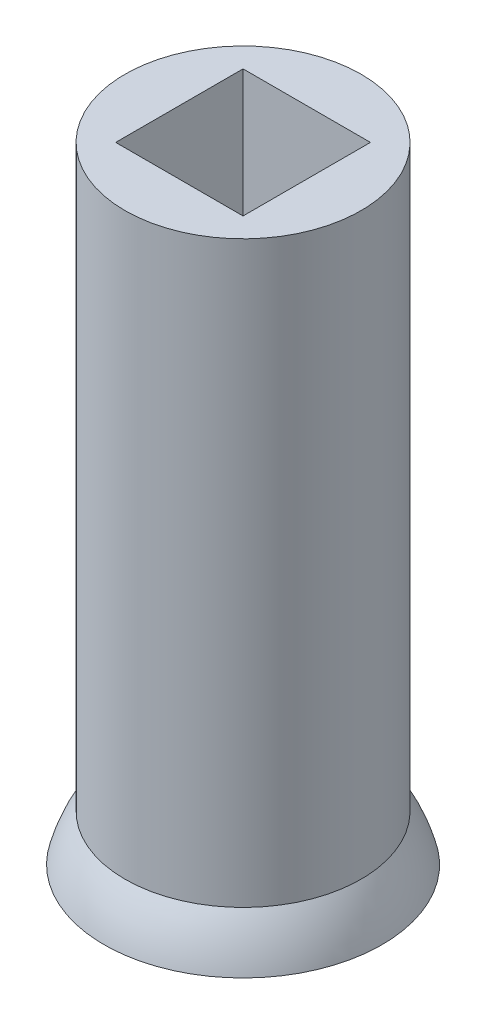
ISO-10303-21;
HEADER;
FILE_DESCRIPTION(('STEP AP214'),'2;1');
FILE_NAME('part.step','',(''),(''),'','','');
FILE_SCHEMA(('AUTOMOTIVE_DESIGN { 1 0 10303 214 1 1 1 1 }'));
ENDSEC;
DATA;
#1=APPLICATION_CONTEXT('core data for automotive mechanical design processes');
#2=APPLICATION_PROTOCOL_DEFINITION('international standard','automotive_design',2000,#1);
#3=PRODUCT_CONTEXT('',#1,'mechanical');
#4=PRODUCT('Part','Part','',(#3));
#5=PRODUCT_RELATED_PRODUCT_CATEGORY('part','',(#4));
#6=PRODUCT_DEFINITION_FORMATION('','',#4);
#7=PRODUCT_DEFINITION_CONTEXT('part definition',#1,'design');
#8=PRODUCT_DEFINITION('design','',#6,#7);
#9=PRODUCT_DEFINITION_SHAPE('','',#8);
#10=(LENGTH_UNIT() NAMED_UNIT(*) SI_UNIT(.MILLI.,.METRE.));
#11=(NAMED_UNIT(*) PLANE_ANGLE_UNIT() SI_UNIT($,.RADIAN.));
#12=(NAMED_UNIT(*) SI_UNIT($,.STERADIAN.) SOLID_ANGLE_UNIT());
#13=UNCERTAINTY_MEASURE_WITH_UNIT(LENGTH_MEASURE(1.E-05),#10,'distance_accuracy_value','');
#14=(GEOMETRIC_REPRESENTATION_CONTEXT(3) GLOBAL_UNCERTAINTY_ASSIGNED_CONTEXT((#13)) GLOBAL_UNIT_ASSIGNED_CONTEXT((#10,
#11,#12)) REPRESENTATION_CONTEXT('',''));
#15=CARTESIAN_POINT('',(0.,0.,0.));
#16=DIRECTION('',(0.,0.,1.));
#17=DIRECTION('',(1.,0.,0.));
#18=AXIS2_PLACEMENT_3D('',#15,#16,#17);
#19=CARTESIAN_POINT('',(0.,7.,0.));
#20=DIRECTION('',(0.,1.,0.));
#21=DIRECTION('',(0.,0.,1.));
#22=AXIS2_PLACEMENT_3D('',#19,#20,#21);
#23=PLANE('',#22);
#24=DIRECTION('',(-1.,0.,0.));
#25=VECTOR('',#24,1.);
#26=CARTESIAN_POINT('',(-1.49,7.,-1.99));
#27=LINE('',#26,#25);
#28=CARTESIAN_POINT('',(1.49,7.,-1.99));
#29=VERTEX_POINT('',#28);
#30=CARTESIAN_POINT('',(-1.49,7.,-1.99));
#31=VERTEX_POINT('',#30);
#32=EDGE_CURVE('E189',#29,#31,#27,.T.);
#33=ORIENTED_EDGE('',*,*,#32,.F.);
#34=DIRECTION('',(0.,0.,-1.));
#35=VECTOR('',#34,1.);
#36=CARTESIAN_POINT('',(1.49,7.,-1.99));
#37=LINE('',#36,#35);
#38=CARTESIAN_POINT('',(1.49,7.,1.99));
#39=VERTEX_POINT('',#38);
#40=EDGE_CURVE('E186',#39,#29,#37,.T.);
#41=ORIENTED_EDGE('',*,*,#40,.F.);
#42=DIRECTION('',(1.,0.,0.));
#43=VECTOR('',#42,1.);
#44=CARTESIAN_POINT('',(-1.49,7.,1.99));
#45=LINE('',#44,#43);
#46=CARTESIAN_POINT('',(-1.49,7.,1.99));
#47=VERTEX_POINT('',#46);
#48=EDGE_CURVE('E196',#47,#39,#45,.T.);
#49=ORIENTED_EDGE('',*,*,#48,.F.);
#50=DIRECTION('',(0.,0.,1.));
#51=VECTOR('',#50,1.);
#52=CARTESIAN_POINT('',(-1.49,7.,-1.99));
#53=LINE('',#52,#51);
#54=EDGE_CURVE('E193',#31,#47,#53,.T.);
#55=ORIENTED_EDGE('',*,*,#54,.F.);
#56=EDGE_LOOP('',(#33,#41,#49,#55));
#57=FACE_BOUND('',#56,.T.);
#58=DIRECTION('',(1.,0.,0.));
#59=VECTOR('',#58,1.);
#60=CARTESIAN_POINT('',(-5.5,7.,5.5));
#61=LINE('',#60,#59);
#62=CARTESIAN_POINT('',(-5.5,7.,5.5));
#63=VERTEX_POINT('',#62);
#64=CARTESIAN_POINT('',(5.5,7.,5.5));
#65=VERTEX_POINT('',#64);
#66=EDGE_CURVE('E124',#63,#65,#61,.T.);
#67=ORIENTED_EDGE('',*,*,#66,.T.);
#68=DIRECTION('',(0.,0.,-1.));
#69=VECTOR('',#68,1.);
#70=CARTESIAN_POINT('',(5.5,7.,-5.5));
#71=LINE('',#70,#69);
#72=CARTESIAN_POINT('',(5.5,7.,-5.5));
#73=VERTEX_POINT('',#72);
#74=EDGE_CURVE('E147',#65,#73,#71,.T.);
#75=ORIENTED_EDGE('',*,*,#74,.T.);
#76=DIRECTION('',(-1.,0.,0.));
#77=VECTOR('',#76,1.);
#78=CARTESIAN_POINT('',(-5.5,7.,-5.5));
#79=LINE('',#78,#77);
#80=CARTESIAN_POINT('',(-5.5,7.,-5.5));
#81=VERTEX_POINT('',#80);
#82=EDGE_CURVE('E130',#73,#81,#79,.T.);
#83=ORIENTED_EDGE('',*,*,#82,.T.);
#84=DIRECTION('',(0.,0.,1.));
#85=VECTOR('',#84,1.);
#86=CARTESIAN_POINT('',(-5.5,7.,-5.5));
#87=LINE('',#86,#85);
#88=EDGE_CURVE('E152',#81,#63,#87,.T.);
#89=ORIENTED_EDGE('',*,*,#88,.T.);
#90=EDGE_LOOP('',(#67,#75,#83,#89));
#91=FACE_BOUND('',#90,.T.);
#92=ADVANCED_FACE('F47',(#57,#91),#23,.T.);
#93=CARTESIAN_POINT('',(0.,7.,0.));
#94=DIRECTION('',(0.,-1.,0.));
#95=DIRECTION('',(0.,0.,-1.));
#96=AXIS2_PLACEMENT_3D('',#93,#94,#95);
#97=CYLINDRICAL_SURFACE('',#96,3.49);
#98=CARTESIAN_POINT('',(0.,0.,0.));
#99=DIRECTION('',(0.,1.,0.));
#100=DIRECTION('',(0.,0.,1.));
#101=AXIS2_PLACEMENT_3D('',#98,#99,#100);
#102=CIRCLE('',#101,3.49);
#103=CARTESIAN_POINT('',(0.,0.,3.49));
#104=VERTEX_POINT('',#103);
#105=EDGE_CURVE('E56',#104,#104,#102,.T.);
#106=ORIENTED_EDGE('',*,*,#105,.T.);
#107=EDGE_LOOP('',(#106));
#108=FACE_BOUND('',#107,.T.);
#109=CARTESIAN_POINT('',(0.,6.,0.));
#110=DIRECTION('',(0.,1.,0.));
#111=DIRECTION('',(0.,0.,1.));
#112=AXIS2_PLACEMENT_3D('',#109,#110,#111);
#113=CIRCLE('',#112,3.49);
#114=CARTESIAN_POINT('',(0.,6.,3.49));
#115=VERTEX_POINT('',#114);
#116=EDGE_CURVE('E11',#115,#115,#113,.T.);
#117=ORIENTED_EDGE('',*,*,#116,.F.);
#118=EDGE_LOOP('',(#117));
#119=FACE_BOUND('',#118,.T.);
#120=ADVANCED_FACE('F49',(#108,#119),#97,.T.);
#121=CARTESIAN_POINT('',(0.,0.,0.));
#122=DIRECTION('',(0.,1.,0.));
#123=DIRECTION('',(0.,0.,1.));
#124=AXIS2_PLACEMENT_3D('',#121,#122,#123);
#125=PLANE('',#124);
#126=ORIENTED_EDGE('',*,*,#105,.F.);
#127=EDGE_LOOP('',(#126));
#128=FACE_BOUND('',#127,.T.);
#129=DIRECTION('',(0.,0.,-1.));
#130=VECTOR('',#129,1.);
#131=CARTESIAN_POINT('',(1.49,0.,-1.99));
#132=LINE('',#131,#130);
#133=CARTESIAN_POINT('',(1.49,0.,1.99));
#134=VERTEX_POINT('',#133);
#135=CARTESIAN_POINT('',(1.49,0.,-1.99));
#136=VERTEX_POINT('',#135);
#137=EDGE_CURVE('E185',#134,#136,#132,.T.);
#138=ORIENTED_EDGE('',*,*,#137,.T.);
#139=DIRECTION('',(-1.,0.,0.));
#140=VECTOR('',#139,1.);
#141=CARTESIAN_POINT('',(-1.49,0.,-1.99));
#142=LINE('',#141,#140);
#143=CARTESIAN_POINT('',(-1.49,0.,-1.99));
#144=VERTEX_POINT('',#143);
#145=EDGE_CURVE('E203',#136,#144,#142,.T.);
#146=ORIENTED_EDGE('',*,*,#145,.T.);
#147=DIRECTION('',(0.,0.,1.));
#148=VECTOR('',#147,1.);
#149=CARTESIAN_POINT('',(-1.49,0.,-1.99));
#150=LINE('',#149,#148);
#151=CARTESIAN_POINT('',(-1.49,0.,1.99));
#152=VERTEX_POINT('',#151);
#153=EDGE_CURVE('E207',#144,#152,#150,.T.);
#154=ORIENTED_EDGE('',*,*,#153,.T.);
#155=DIRECTION('',(1.,0.,0.));
#156=VECTOR('',#155,1.);
#157=CARTESIAN_POINT('',(-1.49,0.,1.99));
#158=LINE('',#157,#156);
#159=EDGE_CURVE('E190',#152,#134,#158,.T.);
#160=ORIENTED_EDGE('',*,*,#159,.T.);
#161=EDGE_LOOP('',(#138,#146,#154,#160));
#162=FACE_BOUND('',#161,.T.);
#163=ADVANCED_FACE('F231',(#128,#162),#125,.F.);
#164=CARTESIAN_POINT('',(1.49,7.,-1.99));
#165=DIRECTION('',(-1.,0.,0.));
#166=DIRECTION('',(0.,0.,1.));
#167=AXIS2_PLACEMENT_3D('',#164,#165,#166);
#168=PLANE('',#167);
#169=ORIENTED_EDGE('',*,*,#137,.F.);
#170=DIRECTION('',(0.,-1.,0.));
#171=VECTOR('',#170,1.);
#172=CARTESIAN_POINT('',(1.49,7.,1.99));
#173=LINE('',#172,#171);
#174=EDGE_CURVE('E199',#39,#134,#173,.T.);
#175=ORIENTED_EDGE('',*,*,#174,.F.);
#176=ORIENTED_EDGE('',*,*,#40,.T.);
#177=DIRECTION('',(0.,-1.,0.));
#178=VECTOR('',#177,1.);
#179=CARTESIAN_POINT('',(1.49,7.,-1.99));
#180=LINE('',#179,#178);
#181=EDGE_CURVE('E222',#29,#136,#180,.T.);
#182=ORIENTED_EDGE('',*,*,#181,.T.);
#183=EDGE_LOOP('',(#169,#175,#176,#182));
#184=FACE_BOUND('',#183,.T.);
#185=ADVANCED_FACE('F234',(#184),#168,.T.);
#186=CARTESIAN_POINT('',(-1.49,7.,-1.99));
#187=DIRECTION('',(0.,0.,1.));
#188=DIRECTION('',(1.,0.,0.));
#189=AXIS2_PLACEMENT_3D('',#186,#187,#188);
#190=PLANE('',#189);
#191=ORIENTED_EDGE('',*,*,#145,.F.);
#192=ORIENTED_EDGE('',*,*,#181,.F.);
#193=ORIENTED_EDGE('',*,*,#32,.T.);
#194=DIRECTION('',(0.,-1.,0.));
#195=VECTOR('',#194,1.);
#196=CARTESIAN_POINT('',(-1.49,7.,-1.99));
#197=LINE('',#196,#195);
#198=EDGE_CURVE('E219',#31,#144,#197,.T.);
#199=ORIENTED_EDGE('',*,*,#198,.T.);
#200=EDGE_LOOP('',(#191,#192,#193,#199));
#201=FACE_BOUND('',#200,.T.);
#202=ADVANCED_FACE('F246',(#201),#190,.T.);
#203=CARTESIAN_POINT('',(-1.49,7.,-1.99));
#204=DIRECTION('',(1.,0.,0.));
#205=DIRECTION('',(0.,0.,-1.));
#206=AXIS2_PLACEMENT_3D('',#203,#204,#205);
#207=PLANE('',#206);
#208=ORIENTED_EDGE('',*,*,#153,.F.);
#209=ORIENTED_EDGE('',*,*,#198,.F.);
#210=ORIENTED_EDGE('',*,*,#54,.T.);
#211=DIRECTION('',(0.,-1.,0.));
#212=VECTOR('',#211,1.);
#213=CARTESIAN_POINT('',(-1.49,7.,1.99));
#214=LINE('',#213,#212);
#215=EDGE_CURVE('E71',#47,#152,#214,.T.);
#216=ORIENTED_EDGE('',*,*,#215,.T.);
#217=EDGE_LOOP('',(#208,#209,#210,#216));
#218=FACE_BOUND('',#217,.T.);
#219=ADVANCED_FACE('F250',(#218),#207,.T.);
#220=CARTESIAN_POINT('',(-1.49,7.,1.99));
#221=DIRECTION('',(0.,0.,-1.));
#222=DIRECTION('',(-1.,0.,0.));
#223=AXIS2_PLACEMENT_3D('',#220,#221,#222);
#224=PLANE('',#223);
#225=ORIENTED_EDGE('',*,*,#159,.F.);
#226=ORIENTED_EDGE('',*,*,#215,.F.);
#227=ORIENTED_EDGE('',*,*,#48,.T.);
#228=ORIENTED_EDGE('',*,*,#174,.T.);
#229=EDGE_LOOP('',(#225,#226,#227,#228));
#230=FACE_BOUND('',#229,.T.);
#231=ADVANCED_FACE('F239',(#230),#224,.T.);
#232=CARTESIAN_POINT('',(0.,0.,0.));
#233=DIRECTION('',(0.,-1.,0.));
#234=DIRECTION('',(0.,0.,-1.));
#235=AXIS2_PLACEMENT_3D('',#232,#233,#234);
#236=SPHERICAL_SURFACE('',#235,10.4403065089105);
#237=CARTESIAN_POINT('',(0.,6.,0.));
#238=DIRECTION('',(0.,-1.,0.));
#239=DIRECTION('',(0.,0.,-1.));
#240=AXIS2_PLACEMENT_3D('',#237,#238,#239);
#241=CIRCLE('',#240,8.54400374531753);
#242=CARTESIAN_POINT('',(0.,6.,-8.54400374531753));
#243=VERTEX_POINT('',#242);
#244=EDGE_CURVE('E170',#243,#243,#241,.T.);
#245=CARTESIAN_POINT('',(0.,3.,0.));
#246=DIRECTION('',(0.,-1.,0.));
#247=DIRECTION('',(0.,0.,-1.));
#248=AXIS2_PLACEMENT_3D('',#245,#246,#247);
#249=CIRCLE('',#248,10.);
#250=CARTESIAN_POINT('',(0.,3.,-10.));
#251=VERTEX_POINT('',#250);
#252=EDGE_CURVE('E181',#251,#251,#249,.T.);
#253=CARTESIAN_POINT('',(0.,6.,-8.54400374531753));
#254=CARTESIAN_POINT('',(0.,5.97145096676008,-8.56405222263759));
#255=CARTESIAN_POINT('',(0.,5.94280144117948,-8.58395759861116));
#256=CARTESIAN_POINT('',(0.,5.88530429986779,-8.6234801705224));
#257=CARTESIAN_POINT('',(0.,5.8564566841367,-8.64309736646007));
#258=CARTESIAN_POINT('',(0.,5.79856625705491,-8.68204160095653));
#259=CARTESIAN_POINT('',(0.,5.76952344570421,-8.70136863951534));
#260=CARTESIAN_POINT('',(0.,5.71124554686172,-8.73973061882663));
#261=CARTESIAN_POINT('',(0.,5.68201045936994,-8.75876555957911));
#262=CARTESIAN_POINT('',(0.,5.62335094561547,-8.79654143012251));
#263=CARTESIAN_POINT('',(0.,5.59392651935278,-8.81528235991343));
#264=CARTESIAN_POINT('',(0.,5.53489128483523,-8.85246832547909));
#265=CARTESIAN_POINT('',(0.,5.50528047658036,-8.87091336125383));
#266=CARTESIAN_POINT('',(0.,5.44587545348305,-8.907505685316));
#267=CARTESIAN_POINT('',(0.,5.4160812386406,-8.92565297360342));
#268=CARTESIAN_POINT('',(0.,5.35631239622975,-8.96164797917882));
#269=CARTESIAN_POINT('',(0.,5.32633776866134,-8.97949569646679));
#270=CARTESIAN_POINT('',(0.,5.26621111278149,-9.01488976662264));
#271=CARTESIAN_POINT('',(0.,5.23605908447004,-9.03243611949053));
#272=CARTESIAN_POINT('',(0.,5.17558065691502,-9.0672256976709));
#273=CARTESIAN_POINT('',(0.,5.14525425767144,-9.08446892298339));
#274=CARTESIAN_POINT('',(0.,5.08443013558413,-9.1186505133765));
#275=CARTESIAN_POINT('',(0.,5.05393241274038,-9.13558887845713));
#276=CARTESIAN_POINT('',(0.,4.99276870800019,-9.16915904634397));
#277=CARTESIAN_POINT('',(0.,4.96210272610374,-9.18579084915018));
#278=CARTESIAN_POINT('',(0.,4.90060558471298,-9.21874622125033));
#279=CARTESIAN_POINT('',(0.,4.86977442521867,-9.23506979054428));
#280=CARTESIAN_POINT('',(0.,4.80795002668481,-9.26740705535475));
#281=CARTESIAN_POINT('',(0.,4.77695678764526,-9.28342075087127));
#282=CARTESIAN_POINT('',(0.,4.71481134436006,-9.31513665899922));
#283=CARTESIAN_POINT('',(0.,4.68365914011439,-9.33083887161065));
#284=CARTESIAN_POINT('',(0.,4.62119889672959,-9.36193023609995));
#285=CARTESIAN_POINT('',(0.,4.58989085759045,-9.37731938797783));
#286=CARTESIAN_POINT('',(0.,4.52712209039034,-9.4077830846293));
#287=CARTESIAN_POINT('',(0.,4.49566136232935,-9.42285762940289));
#288=CARTESIAN_POINT('',(0.,4.43259037860004,-9.4526905970882));
#289=CARTESIAN_POINT('',(0.,4.40098012293171,-9.46744901999991));
#290=CARTESIAN_POINT('',(0.,4.3376132603274,-9.49664826096919));
#291=CARTESIAN_POINT('',(0.,4.30585665339142,-9.51108907902676));
#292=CARTESIAN_POINT('',(0.,4.24220027929754,-9.53965165920985));
#293=CARTESIAN_POINT('',(0.,4.21030051213964,-9.55377342133537));
#294=CARTESIAN_POINT('',(0.,4.14636102303302,-9.5816964706366));
#295=CARTESIAN_POINT('',(0.,4.11432130108429,-9.59549775781232));
#296=CARTESIAN_POINT('',(0.,4.05010512189042,-9.62277847039899));
#297=CARTESIAN_POINT('',(0.,4.01792866464528,-9.63625789580994));
#298=CARTESIAN_POINT('',(0.,3.9534422480927,-9.66289353039414));
#299=CARTESIAN_POINT('',(0.,3.92113228878527,-9.67604973956738));
#300=CARTESIAN_POINT('',(0.,3.85638211475724,-9.70203761968169));
#301=CARTESIAN_POINT('',(0.,3.82394190003663,-9.71486929062276));
#302=CARTESIAN_POINT('',(0.,3.75893447491971,-9.74020680488838));
#303=CARTESIAN_POINT('',(0.,3.7263672645234,-9.75271264821294));
#304=CARTESIAN_POINT('',(0.,3.66110912055467,-9.77739725060518));
#305=CARTESIAN_POINT('',(0.,3.62841818698226,-9.78957600967286));
#306=CARTESIAN_POINT('',(0.,3.56291588158932,-9.81360521976543));
#307=CARTESIAN_POINT('',(0.,3.53010450976879,-9.82545567079032));
#308=CARTESIAN_POINT('',(0.,3.46436462492421,-9.84882707404759));
#309=CARTESIAN_POINT('',(0.,3.43143611190016,-9.86034802627999));
#310=CARTESIAN_POINT('',(0.,3.36546525341019,-9.88305927413912));
#311=CARTESIAN_POINT('',(0.,3.33242290794427,-9.89424956976585));
#312=CARTESIAN_POINT('',(0.,3.26622770497136,-9.91629838047187));
#313=CARTESIAN_POINT('',(0.,3.23307484746437,-9.92715689555116));
#314=CARTESIAN_POINT('',(0.,3.16666195116571,-9.9485410521502));
#315=CARTESIAN_POINT('',(0.,3.13340191237405,-9.95906669366995));
#316=CARTESIAN_POINT('',(0.,3.06677799782829,-9.97978405257727));
#317=CARTESIAN_POINT('',(0.,3.03341412207419,-9.98997576996484));
#318=CARTESIAN_POINT('',(0.,3.,-10.));
#319=B_SPLINE_CURVE_WITH_KNOTS('',3,(#253,#254,#255,#256,#257,#258,#259,#260,#261,#262,#263,
#264,#265,#266,#267,#268,#269,#270,#271,#272,#273,#274,#275,#276,#277,#278,#279,#280,#281,#282,
#283,#284,#285,#286,#287,#288,#289,#290,#291,#292,#293,#294,#295,#296,#297,#298,#299,#300,#301,
#302,#303,#304,#305,#306,#307,#308,#309,#310,#311,#312,#313,#314,#315,#316,#317,#318),
.UNSPECIFIED.,.F.,.F.,(4,2,2,2,2,2,2,2,2,2,2,2,2,2,2,2,2,2,2,2,2,2,2,2,2,2,2,2,2,2,2,2,4),(0.,
0.104655658809185,0.209311317618369,0.313966976427552,0.418622635236737,0.523278294045921,
0.627933952855105,0.73258961166429,0.837245270473473,0.941900929282657,1.04655658809184,
1.15121224690103,1.25586790571021,1.36052356451939,1.46517922332858,1.56983488213776,
1.67449054094695,1.77914619975613,1.88380185856531,1.9884575173745,2.09311317618368,
2.19776883499287,2.30242449380205,2.40708015261123,2.51173581142042,2.6163914702296,
2.72104712903879,2.82570278784797,2.93035844665715,3.03501410546634,3.13966976427552,
3.24432542308471,3.34898108189389),.UNSPECIFIED.);
#320=EDGE_CURVE('BSEAM257',#243,#251,#319,.T.);
#321=ORIENTED_EDGE('',*,*,#244,.F.);
#322=ORIENTED_EDGE('',*,*,#252,.T.);
#323=ORIENTED_EDGE('',*,*,#320,.T.);
#324=ORIENTED_EDGE('',*,*,#320,.F.);
#325=EDGE_LOOP('',(#321,#323,#322,#324));
#326=FACE_BOUND('',#325,.T.);
#327=ADVANCED_FACE('F257',(#326),#236,.F.);
#328=CARTESIAN_POINT('',(0.,3.,0.));
#329=DIRECTION('',(0.,1.,0.));
#330=DIRECTION('',(0.,0.,1.));
#331=AXIS2_PLACEMENT_3D('',#328,#329,#330);
#332=PLANE('',#331);
#333=ORIENTED_EDGE('',*,*,#252,.F.);
#334=EDGE_LOOP('',(#333));
#335=FACE_BOUND('',#334,.T.);
#336=CARTESIAN_POINT('',(0.,3.,0.));
#337=DIRECTION('',(0.,-1.,0.));
#338=DIRECTION('',(0.,0.,-1.));
#339=AXIS2_PLACEMENT_3D('',#336,#337,#338);
#340=CIRCLE('',#339,12.);
#341=CARTESIAN_POINT('',(0.,3.,-12.));
#342=VERTEX_POINT('',#341);
#343=EDGE_CURVE('E177',#342,#342,#340,.T.);
#344=ORIENTED_EDGE('',*,*,#343,.T.);
#345=EDGE_LOOP('',(#344));
#346=FACE_BOUND('',#345,.T.);
#347=ADVANCED_FACE('F303',(#335,#346),#332,.F.);
#348=CARTESIAN_POINT('',(0.,0.,0.));
#349=DIRECTION('',(0.,-1.,0.));
#350=DIRECTION('',(0.,0.,-1.));
#351=AXIS2_PLACEMENT_3D('',#348,#349,#350);
#352=SPHERICAL_SURFACE('',#351,12.369316876853);
#353=CARTESIAN_POINT('',(0.,7.,0.));
#354=DIRECTION('',(0.,1.,0.));
#355=DIRECTION('',(0.,0.,1.));
#356=AXIS2_PLACEMENT_3D('',#353,#354,#355);
#357=CIRCLE('',#356,10.1980390271856);
#358=CARTESIAN_POINT('',(0.,7.,-10.1980390271856));
#359=VERTEX_POINT('',#358);
#360=EDGE_CURVE('E132',#359,#359,#357,.T.);
#361=CARTESIAN_POINT('',(0.,7.,-10.1980390271856));
#362=CARTESIAN_POINT('',(0.,6.96212217894636,-10.224038622581));
#363=CARTESIAN_POINT('',(0.,6.92409949286075,-10.2498271691231));
#364=CARTESIAN_POINT('',(0.,6.84776913935271,-10.3009790042866));
#365=CARTESIAN_POINT('',(0.,6.80946147193028,-10.3263422929082));
#366=CARTESIAN_POINT('',(0.,6.7325659044757,-10.3766404520171));
#367=CARTESIAN_POINT('',(0.,6.69397800444355,-10.4015753225044));
#368=CARTESIAN_POINT('',(0.,6.61652676477056,-10.4510135524705));
#369=CARTESIAN_POINT('',(0.,6.57766342512971,-10.4755169119492));
#370=CARTESIAN_POINT('',(0.,6.499666130898,-10.524089076808));
#371=CARTESIAN_POINT('',(0.,6.46053217630713,-10.5481578821881));
#372=CARTESIAN_POINT('',(0.,6.38199851111377,-10.5958579507291));
#373=CARTESIAN_POINT('',(0.,6.34259880051127,-10.61948921389));
#374=CARTESIAN_POINT('',(0.,6.26353851504639,-10.666311263924));
#375=CARTESIAN_POINT('',(0.,6.22387794018401,-10.6895020507971));
#376=CARTESIAN_POINT('',(0.,6.14430085038836,-10.7354402689487));
#377=CARTESIAN_POINT('',(0.,6.10438433545509,-10.7581877002272));
#378=CARTESIAN_POINT('',(0.,6.02430032147061,-10.8032363829092));
#379=CARTESIAN_POINT('',(0.,5.98413282241938,-10.8255376343128));
#380=CARTESIAN_POINT('',(0.,5.9035518273171,-10.8696911883667));
#381=CARTESIAN_POINT('',(0.,5.86313833126604,-10.891543491017));
#382=CARTESIAN_POINT('',(0.,5.78207035982378,-10.9347964344255));
#383=CARTESIAN_POINT('',(0.,5.74141588443258,-10.9561970751836));
#384=CARTESIAN_POINT('',(0.,5.65987100188948,-10.9985440377464));
#385=CARTESIAN_POINT('',(0.,5.61898059473759,-11.0194903595511));
#386=CARTESIAN_POINT('',(0.,5.53696892554532,-11.060926083553));
#387=CARTESIAN_POINT('',(0.,5.49584766350495,-11.0814154857502));
#388=CARTESIAN_POINT('',(0.,5.41337939007045,-11.1219348266135));
#389=CARTESIAN_POINT('',(0.,5.37203237867632,-11.1419647652795));
#390=CARTESIAN_POINT('',(0.,5.2891177400976,-11.1815626922028));
#391=CARTESIAN_POINT('',(0.,5.24755011291302,-11.20113068046));
#392=CARTESIAN_POINT('',(0.,5.16419940370792,-11.2398022770429));
#393=CARTESIAN_POINT('',(0.,5.12241632168741,-11.2589058853686));
#394=CARTESIAN_POINT('',(0.,5.03863989051545,-11.296646350222));
#395=CARTESIAN_POINT('',(0.,4.99664654136399,-11.3152832067497));
#396=CARTESIAN_POINT('',(0.,4.91245478974145,-11.352087854092));
#397=CARTESIAN_POINT('',(0.,4.87025638727036,-11.3702556449065));
#398=CARTESIAN_POINT('',(0.,4.78565976827892,-11.4061199051454));
#399=CARTESIAN_POINT('',(0.,4.74326155175856,-11.4238163745697));
#400=CARTESIAN_POINT('',(0.,4.65827056874742,-11.4587357948693));
#401=CARTESIAN_POINT('',(0.,4.61567780225664,-11.4759587457446));
#402=CARTESIAN_POINT('',(0.,4.53030300753846,-11.5099289905787));
#403=CARTESIAN_POINT('',(0.,4.48752097931106,-11.5266762845375));
#404=CARTESIAN_POINT('',(0.,4.40177297285181,-11.5596931362276));
#405=CARTESIAN_POINT('',(0.,4.35880699461996,-11.575962693959));
#406=CARTESIAN_POINT('',(0.,4.27269642272282,-11.6080220531979));
#407=CARTESIAN_POINT('',(0.,4.22955182905754,-11.6238118547054));
#408=CARTESIAN_POINT('',(0.,4.14308938304119,-11.6549097410666));
#409=CARTESIAN_POINT('',(0.,4.09977153069013,-11.6702178259203));
#410=CARTESIAN_POINT('',(0.,4.01296794556092,-11.7003503783506));
#411=CARTESIAN_POINT('',(0.,3.96948221278277,-11.7151748459274));
#412=CARTESIAN_POINT('',(0.,3.88234826590339,-11.7443383232323));
#413=CARTESIAN_POINT('',(0.,3.83870005180215,-11.7586773329603));
#414=CARTESIAN_POINT('',(0.,3.75124656154798,-11.7868681142468));
#415=CARTESIAN_POINT('',(0.,3.70744128539505,-11.8007198858051));
#416=CARTESIAN_POINT('',(0.,3.61967910983162,-11.8279344710104));
#417=CARTESIAN_POINT('',(0.,3.57572221042113,-11.8412972846573));
#418=CARTESIAN_POINT('',(0.,3.487662245879,-11.8675322946893));
#419=CARTESIAN_POINT('',(0.,3.44355918074735,-11.8804044910743));
#420=CARTESIAN_POINT('',(0.,3.35521236075669,-11.9056566693288));
#421=CARTESIAN_POINT('',(0.,3.31096860589768,-11.9180366511983));
#422=CARTESIAN_POINT('',(0.,3.22234589875782,-11.9423028598661));
#423=CARTESIAN_POINT('',(0.,3.17796694647697,-11.9541890866644));
#424=CARTESIAN_POINT('',(0.,3.08907935789915,-11.9774663224127));
#425=CARTESIAN_POINT('',(0.,3.04457072160218,-11.9888573313627));
#426=CARTESIAN_POINT('',(0.,3.,-12.));
#427=B_SPLINE_CURVE_WITH_KNOTS('',3,(#361,#362,#363,#364,#365,#366,#367,#368,#369,#370,#371,
#372,#373,#374,#375,#376,#377,#378,#379,#380,#381,#382,#383,#384,#385,#386,#387,#388,#389,#390,
#391,#392,#393,#394,#395,#396,#397,#398,#399,#400,#401,#402,#403,#404,#405,#406,#407,#408,#409,
#410,#411,#412,#413,#414,#415,#416,#417,#418,#419,#420,#421,#422,#423,#424,#425,#426),
.UNSPECIFIED.,.F.,.F.,(4,2,2,2,2,2,2,2,2,2,2,2,2,2,2,2,2,2,2,2,2,2,2,2,2,2,2,2,2,2,2,2,4),(0.,
0.137826622781461,0.275653245562921,0.413479868344381,0.551306491125843,0.689133113907303,
0.826959736688764,0.964786359470224,1.10261298225169,1.24043960503315,1.37826622781461,
1.51609285059607,1.65391947337753,1.79174609615899,1.92957271894045,2.06739934172191,
2.20522596450337,2.34305258728483,2.48087921006629,2.61870583284775,2.75653245562921,
2.89435907841067,3.03218570119213,3.17001232397359,3.30783894675505,3.44566556953651,
3.58349219231797,3.72131881509943,3.8591454378809,3.99697206066236,4.13479868344382,
4.27262530622528,4.41045192900674),.UNSPECIFIED.);
#428=EDGE_CURVE('BSEAM313',#359,#342,#427,.T.);
#429=ORIENTED_EDGE('',*,*,#360,.F.);
#430=ORIENTED_EDGE('',*,*,#343,.F.);
#431=ORIENTED_EDGE('',*,*,#428,.T.);
#432=ORIENTED_EDGE('',*,*,#428,.F.);
#433=EDGE_LOOP('',(#429,#431,#430,#432));
#434=FACE_BOUND('',#433,.T.);
#435=ADVANCED_FACE('F313',(#434),#352,.T.);
#436=CARTESIAN_POINT('',(0.,6.,0.));
#437=DIRECTION('',(0.,1.,0.));
#438=DIRECTION('',(0.,0.,1.));
#439=AXIS2_PLACEMENT_3D('',#436,#437,#438);
#440=PLANE('',#439);
#441=ORIENTED_EDGE('',*,*,#116,.T.);
#442=EDGE_LOOP('',(#441));
#443=FACE_BOUND('',#442,.T.);
#444=ORIENTED_EDGE('',*,*,#244,.T.);
#445=EDGE_LOOP('',(#444));
#446=FACE_BOUND('',#445,.T.);
#447=ADVANCED_FACE('F323',(#443,#446),#440,.F.);
#448=CARTESIAN_POINT('',(0.,57.,0.));
#449=DIRECTION('',(0.,1.,0.));
#450=DIRECTION('',(0.,0.,1.));
#451=AXIS2_PLACEMENT_3D('',#448,#449,#450);
#452=PLANE('',#451);
#453=CARTESIAN_POINT('',(0.,57.,0.));
#454=DIRECTION('',(0.,1.,0.));
#455=DIRECTION('',(0.,0.,1.));
#456=AXIS2_PLACEMENT_3D('',#453,#454,#455);
#457=CIRCLE('',#456,10.1980390271856);
#458=CARTESIAN_POINT('',(0.,57.,10.1980390271856));
#459=VERTEX_POINT('',#458);
#460=EDGE_CURVE('E166',#459,#459,#457,.T.);
#461=ORIENTED_EDGE('',*,*,#460,.T.);
#462=EDGE_LOOP('',(#461));
#463=FACE_BOUND('',#462,.T.);
#464=DIRECTION('',(-1.,0.,0.));
#465=VECTOR('',#464,1.);
#466=CARTESIAN_POINT('',(-5.5,57.,-5.5));
#467=LINE('',#466,#465);
#468=CARTESIAN_POINT('',(5.5,57.,-5.5));
#469=VERTEX_POINT('',#468);
#470=CARTESIAN_POINT('',(-5.5,57.,-5.5));
#471=VERTEX_POINT('',#470);
#472=EDGE_CURVE('E123',#469,#471,#467,.T.);
#473=ORIENTED_EDGE('',*,*,#472,.F.);
#474=DIRECTION('',(0.,0.,-1.));
#475=VECTOR('',#474,1.);
#476=CARTESIAN_POINT('',(5.5,57.,-5.5));
#477=LINE('',#476,#475);
#478=CARTESIAN_POINT('',(5.5,57.,5.5));
#479=VERTEX_POINT('',#478);
#480=EDGE_CURVE('E114',#479,#469,#477,.T.);
#481=ORIENTED_EDGE('',*,*,#480,.F.);
#482=DIRECTION('',(1.,0.,0.));
#483=VECTOR('',#482,1.);
#484=CARTESIAN_POINT('',(-5.5,57.,5.5));
#485=LINE('',#484,#483);
#486=CARTESIAN_POINT('',(-5.5,57.,5.5));
#487=VERTEX_POINT('',#486);
#488=EDGE_CURVE('E142',#487,#479,#485,.T.);
#489=ORIENTED_EDGE('',*,*,#488,.F.);
#490=DIRECTION('',(0.,0.,1.));
#491=VECTOR('',#490,1.);
#492=CARTESIAN_POINT('',(-5.5,57.,-5.5));
#493=LINE('',#492,#491);
#494=EDGE_CURVE('E138',#471,#487,#493,.T.);
#495=ORIENTED_EDGE('',*,*,#494,.F.);
#496=EDGE_LOOP('',(#473,#481,#489,#495));
#497=FACE_BOUND('',#496,.T.);
#498=ADVANCED_FACE('F136',(#463,#497),#452,.T.);
#499=CARTESIAN_POINT('',(0.,57.,0.));
#500=DIRECTION('',(0.,-1.,0.));
#501=DIRECTION('',(0.,0.,-1.));
#502=AXIS2_PLACEMENT_3D('',#499,#500,#501);
#503=CYLINDRICAL_SURFACE('',#502,10.1980390271856);
#504=ORIENTED_EDGE('',*,*,#460,.F.);
#505=EDGE_LOOP('',(#504));
#506=FACE_BOUND('',#505,.T.);
#507=ORIENTED_EDGE('',*,*,#360,.T.);
#508=EDGE_LOOP('',(#507));
#509=FACE_BOUND('',#508,.T.);
#510=ADVANCED_FACE('F347',(#506,#509),#503,.T.);
#511=CARTESIAN_POINT('',(5.5,57.,-5.5));
#512=DIRECTION('',(-1.,0.,0.));
#513=DIRECTION('',(0.,0.,1.));
#514=AXIS2_PLACEMENT_3D('',#511,#512,#513);
#515=PLANE('',#514);
#516=ORIENTED_EDGE('',*,*,#74,.F.);
#517=DIRECTION('',(0.,-1.,0.));
#518=VECTOR('',#517,1.);
#519=CARTESIAN_POINT('',(5.5,57.,5.5));
#520=LINE('',#519,#518);
#521=EDGE_CURVE('E63',#479,#65,#520,.T.);
#522=ORIENTED_EDGE('',*,*,#521,.F.);
#523=ORIENTED_EDGE('',*,*,#480,.T.);
#524=DIRECTION('',(0.,-1.,0.));
#525=VECTOR('',#524,1.);
#526=CARTESIAN_POINT('',(5.5,57.,-5.5));
#527=LINE('',#526,#525);
#528=EDGE_CURVE('E117',#469,#73,#527,.T.);
#529=ORIENTED_EDGE('',*,*,#528,.T.);
#530=EDGE_LOOP('',(#516,#522,#523,#529));
#531=FACE_BOUND('',#530,.T.);
#532=ADVANCED_FACE('F116',(#531),#515,.T.);
#533=CARTESIAN_POINT('',(-5.5,57.,-5.5));
#534=DIRECTION('',(0.,0.,1.));
#535=DIRECTION('',(1.,0.,0.));
#536=AXIS2_PLACEMENT_3D('',#533,#534,#535);
#537=PLANE('',#536);
#538=ORIENTED_EDGE('',*,*,#82,.F.);
#539=ORIENTED_EDGE('',*,*,#528,.F.);
#540=ORIENTED_EDGE('',*,*,#472,.T.);
#541=DIRECTION('',(0.,-1.,0.));
#542=VECTOR('',#541,1.);
#543=CARTESIAN_POINT('',(-5.5,57.,-5.5));
#544=LINE('',#543,#542);
#545=EDGE_CURVE('E133',#471,#81,#544,.T.);
#546=ORIENTED_EDGE('',*,*,#545,.T.);
#547=EDGE_LOOP('',(#538,#539,#540,#546));
#548=FACE_BOUND('',#547,.T.);
#549=ADVANCED_FACE('F127',(#548),#537,.T.);
#550=CARTESIAN_POINT('',(-5.5,57.,-5.5));
#551=DIRECTION('',(1.,0.,0.));
#552=DIRECTION('',(0.,0.,-1.));
#553=AXIS2_PLACEMENT_3D('',#550,#551,#552);
#554=PLANE('',#553);
#555=ORIENTED_EDGE('',*,*,#88,.F.);
#556=ORIENTED_EDGE('',*,*,#545,.F.);
#557=ORIENTED_EDGE('',*,*,#494,.T.);
#558=DIRECTION('',(0.,-1.,0.));
#559=VECTOR('',#558,1.);
#560=CARTESIAN_POINT('',(-5.5,57.,5.5));
#561=LINE('',#560,#559);
#562=EDGE_CURVE('E161',#487,#63,#561,.T.);
#563=ORIENTED_EDGE('',*,*,#562,.T.);
#564=EDGE_LOOP('',(#555,#556,#557,#563));
#565=FACE_BOUND('',#564,.T.);
#566=ADVANCED_FACE('F374',(#565),#554,.T.);
#567=CARTESIAN_POINT('',(-5.5,57.,5.5));
#568=DIRECTION('',(0.,0.,-1.));
#569=DIRECTION('',(-1.,0.,0.));
#570=AXIS2_PLACEMENT_3D('',#567,#568,#569);
#571=PLANE('',#570);
#572=ORIENTED_EDGE('',*,*,#66,.F.);
#573=ORIENTED_EDGE('',*,*,#562,.F.);
#574=ORIENTED_EDGE('',*,*,#488,.T.);
#575=ORIENTED_EDGE('',*,*,#521,.T.);
#576=EDGE_LOOP('',(#572,#573,#574,#575));
#577=FACE_BOUND('',#576,.T.);
#578=ADVANCED_FACE('F383',(#577),#571,.T.);
#579=CLOSED_SHELL('',(#92,#120,#163,#185,#202,#219,#231,#327,#347,#435,#447,#498,#510,#532,#549,
#566,#578));
#580=MANIFOLD_SOLID_BREP('B2',#579);
#581=ADVANCED_BREP_SHAPE_REPRESENTATION('',(#18,#580),#14);
#582=SHAPE_DEFINITION_REPRESENTATION(#9,#581);
ENDSEC;
END-ISO-10303-21;
